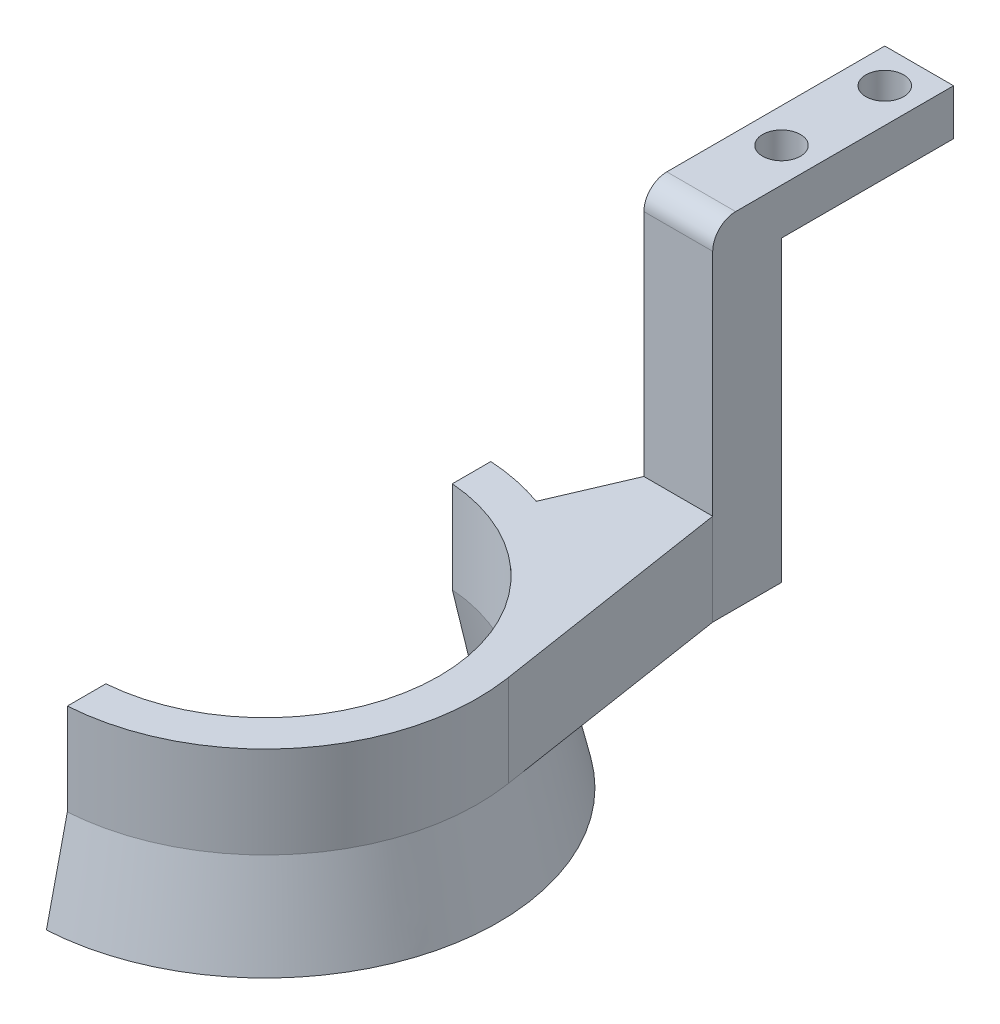
ISO-10303-21;
HEADER;
FILE_DESCRIPTION(('STEP AP214'),'2;1');
FILE_NAME('part.step','',(''),(''),'','','');
FILE_SCHEMA(('AUTOMOTIVE_DESIGN { 1 0 10303 214 1 1 1 1 }'));
ENDSEC;
DATA;
#1=APPLICATION_CONTEXT('core data for automotive mechanical design processes');
#2=APPLICATION_PROTOCOL_DEFINITION('international standard','automotive_design',2000,#1);
#3=PRODUCT_CONTEXT('',#1,'mechanical');
#4=PRODUCT('Part','Part','',(#3));
#5=PRODUCT_RELATED_PRODUCT_CATEGORY('part','',(#4));
#6=PRODUCT_DEFINITION_FORMATION('','',#4);
#7=PRODUCT_DEFINITION_CONTEXT('part definition',#1,'design');
#8=PRODUCT_DEFINITION('design','',#6,#7);
#9=PRODUCT_DEFINITION_SHAPE('','',#8);
#10=(LENGTH_UNIT() NAMED_UNIT(*) SI_UNIT(.MILLI.,.METRE.));
#11=(NAMED_UNIT(*) PLANE_ANGLE_UNIT() SI_UNIT($,.RADIAN.));
#12=(NAMED_UNIT(*) SI_UNIT($,.STERADIAN.) SOLID_ANGLE_UNIT());
#13=UNCERTAINTY_MEASURE_WITH_UNIT(LENGTH_MEASURE(1.E-05),#10,'distance_accuracy_value','');
#14=(GEOMETRIC_REPRESENTATION_CONTEXT(3) GLOBAL_UNCERTAINTY_ASSIGNED_CONTEXT((#13)) GLOBAL_UNIT_ASSIGNED_CONTEXT((#10,
#11,#12)) REPRESENTATION_CONTEXT('',''));
#15=CARTESIAN_POINT('',(0.,0.,0.));
#16=DIRECTION('',(0.,0.,1.));
#17=DIRECTION('',(1.,0.,0.));
#18=AXIS2_PLACEMENT_3D('',#15,#16,#17);
#19=CARTESIAN_POINT('',(56.,-20.,0.));
#20=DIRECTION('',(0.,1.,0.));
#21=DIRECTION('',(0.,0.,1.));
#22=AXIS2_PLACEMENT_3D('',#19,#20,#21);
#23=PLANE('',#22);
#24=DIRECTION('',(-1.,0.,0.));
#25=VECTOR('',#24,1.);
#26=CARTESIAN_POINT('',(56.,-20.,21.));
#27=LINE('',#26,#25);
#28=CARTESIAN_POINT('',(56.,-20.,21.));
#29=VERTEX_POINT('',#28);
#30=CARTESIAN_POINT('',(50.,-20.,21.));
#31=VERTEX_POINT('',#30);
#32=EDGE_CURVE('E356',#29,#31,#27,.T.);
#33=ORIENTED_EDGE('',*,*,#32,.T.);
#34=DIRECTION('',(-0.394272189935279,0.,0.918993710665987));
#35=VECTOR('',#34,1.);
#36=CARTESIAN_POINT('',(58.5417102781997,-20.,1.09045977783739));
#37=LINE('',#36,#35);
#38=CARTESIAN_POINT('',(47.1838265434992,-20.,27.5641091629961));
#39=VERTEX_POINT('',#38);
#40=EDGE_CURVE('E234',#31,#39,#37,.T.);
#41=ORIENTED_EDGE('',*,*,#40,.T.);
#42=CARTESIAN_POINT('',(41.,-20.,45.));
#43=DIRECTION('',(0.,-1.,0.));
#44=DIRECTION('',(0.,0.,1.));
#45=AXIS2_PLACEMENT_3D('',#42,#43,#44);
#46=CIRCLE('',#45,18.5);
#47=CARTESIAN_POINT('',(42.2,-20.,26.5389599426251));
#48=VERTEX_POINT('',#47);
#49=EDGE_CURVE('E230',#48,#39,#46,.T.);
#50=ORIENTED_EDGE('',*,*,#49,.F.);
#51=DIRECTION('',(0.,0.,1.));
#52=VECTOR('',#51,1.);
#53=CARTESIAN_POINT('',(42.2,-20.,0.));
#54=LINE('',#53,#52);
#55=CARTESIAN_POINT('',(42.2,-20.,29.8975995285518));
#56=VERTEX_POINT('',#55);
#57=EDGE_CURVE('E235',#48,#56,#54,.T.);
#58=ORIENTED_EDGE('',*,*,#57,.T.);
#59=CARTESIAN_POINT('',(41.,-20.,45.));
#60=DIRECTION('',(0.,-1.,0.));
#61=DIRECTION('',(0.,0.,1.));
#62=AXIS2_PLACEMENT_3D('',#59,#60,#61);
#63=CIRCLE('',#62,15.15);
#64=CARTESIAN_POINT('',(42.2,-20.0000000000001,60.1024004714482));
#65=VERTEX_POINT('',#64);
#66=EDGE_CURVE('E226',#56,#65,#63,.T.);
#67=ORIENTED_EDGE('',*,*,#66,.T.);
#68=CARTESIAN_POINT('',(42.2,-20.0000000000001,63.4610400573749));
#69=VERTEX_POINT('',#68);
#70=EDGE_CURVE('E240',#65,#69,#54,.T.);
#71=ORIENTED_EDGE('',*,*,#70,.T.);
#72=CARTESIAN_POINT('',(59.2956971835305,-20.,42.2582004871701));
#73=VERTEX_POINT('',#72);
#74=EDGE_CURVE('E238',#73,#69,#46,.T.);
#75=ORIENTED_EDGE('',*,*,#74,.F.);
#76=CARTESIAN_POINT('',(41.,-20.,45.));
#77=DIRECTION('',(0.,-1.,0.));
#78=DIRECTION('',(0.987408050601735,0.,-0.158193999907965));
#79=AXIS2_PLACEMENT_3D('',#76,#77,#78);
#80=CIRCLE('',#79,18.5);
#81=CARTESIAN_POINT('',(59.2670489361321,-20.,42.0734110017026));
#82=VERTEX_POINT('',#81);
#83=EDGE_CURVE('E55',#82,#73,#80,.T.);
#84=ORIENTED_EDGE('',*,*,#83,.F.);
#85=DIRECTION('',(0.153201646089768,0.,0.988194948193617));
#86=VECTOR('',#85,1.);
#87=CARTESIAN_POINT('',(56.,-20.,21.));
#88=LINE('',#87,#86);
#89=EDGE_CURVE('E218',#29,#82,#88,.T.);
#90=ORIENTED_EDGE('',*,*,#89,.F.);
#91=EDGE_LOOP('',(#33,#41,#50,#58,#67,#71,#75,#84,#90));
#92=FACE_BOUND('',#91,.T.);
#93=ADVANCED_FACE('F45',(#92),#23,.T.);
#94=CARTESIAN_POINT('',(56.,-28.,0.));
#95=DIRECTION('',(0.,1.,0.));
#96=DIRECTION('',(0.,0.,1.));
#97=AXIS2_PLACEMENT_3D('',#94,#95,#96);
#98=PLANE('',#97);
#99=DIRECTION('',(-0.394272189935279,0.,0.918993710665987));
#100=VECTOR('',#99,1.);
#101=CARTESIAN_POINT('',(58.5417102781997,-28.,1.09045977783738));
#102=LINE('',#101,#100);
#103=CARTESIAN_POINT('',(50.,-28.,21.));
#104=VERTEX_POINT('',#103);
#105=CARTESIAN_POINT('',(47.1838587987285,-28.,27.5640274167845));
#106=VERTEX_POINT('',#105);
#107=EDGE_CURVE('E251',#104,#106,#102,.T.);
#108=ORIENTED_EDGE('',*,*,#107,.F.);
#109=DIRECTION('',(0.,0.,1.));
#110=VECTOR('',#109,1.);
#111=CARTESIAN_POINT('',(50.,-28.,15.));
#112=LINE('',#111,#110);
#113=CARTESIAN_POINT('',(50.,-28.,15.));
#114=VERTEX_POINT('',#113);
#115=EDGE_CURVE('E338',#114,#104,#112,.T.);
#116=ORIENTED_EDGE('',*,*,#115,.F.);
#117=DIRECTION('',(-1.,0.,0.));
#118=VECTOR('',#117,1.);
#119=CARTESIAN_POINT('',(56.,-28.,15.));
#120=LINE('',#119,#118);
#121=CARTESIAN_POINT('',(56.,-28.,15.));
#122=VERTEX_POINT('',#121);
#123=EDGE_CURVE('E335',#122,#114,#120,.T.);
#124=ORIENTED_EDGE('',*,*,#123,.F.);
#125=DIRECTION('',(0.,0.,-1.));
#126=VECTOR('',#125,1.);
#127=CARTESIAN_POINT('',(56.,-28.,15.));
#128=LINE('',#127,#126);
#129=CARTESIAN_POINT('',(56.,-28.,21.));
#130=VERTEX_POINT('',#129);
#131=EDGE_CURVE('E333',#130,#122,#128,.T.);
#132=ORIENTED_EDGE('',*,*,#131,.F.);
#133=DIRECTION('',(0.153201646089768,0.,0.988194948193617));
#134=VECTOR('',#133,1.);
#135=CARTESIAN_POINT('',(56.,-28.,21.));
#136=LINE('',#135,#134);
#137=CARTESIAN_POINT('',(59.2670484929375,-28.,42.0734110604464));
#138=VERTEX_POINT('',#137);
#139=EDGE_CURVE('E215',#130,#138,#136,.T.);
#140=ORIENTED_EDGE('',*,*,#139,.T.);
#141=CARTESIAN_POINT('',(42.2,-28.,26.5389599426251));
#142=CARTESIAN_POINT('',(74.8133971291866,-28.,28.6588879874911));
#143=CARTESIAN_POINT('',(74.8133971291866,-28.0000000000001,61.3411120125089));
#144=CARTESIAN_POINT('',(42.2,-28.0000000000001,63.4610400573749));
#145=(BOUNDED_CURVE() B_SPLINE_CURVE(3,(#141,#142,#143,#144),.UNSPECIFIED.,.F.,
.F.) B_SPLINE_CURVE_WITH_KNOTS((4,4),(0.,1.),
.UNSPECIFIED.) CURVE() GEOMETRIC_REPRESENTATION_ITEM() RATIONAL_B_SPLINE_CURVE((1.,
0.376576576576576,0.376576576576576,1.)) REPRESENTATION_ITEM(''));
#146=EDGE_CURVE('E11',#106,#138,#145,.T.);
#147=ORIENTED_EDGE('',*,*,#146,.F.);
#148=EDGE_LOOP('',(#108,#116,#124,#132,#140,#147));
#149=FACE_BOUND('',#148,.T.);
#150=ADVANCED_FACE('F482',(#149),#98,.F.);
#151=CARTESIAN_POINT('',(42.2,-28.,0.));
#152=DIRECTION('',(1.,0.,0.));
#153=DIRECTION('',(0.,0.,1.));
#154=AXIS2_PLACEMENT_3D('',#151,#152,#153);
#155=PLANE('',#154);
#156=DIRECTION('',(0.,1.,0.));
#157=VECTOR('',#156,1.);
#158=CARTESIAN_POINT('',(42.2,-28.0000000000001,63.4610400573749));
#159=LINE('',#158,#157);
#160=CARTESIAN_POINT('',(42.2,-28.0000000000001,63.4610400573749));
#161=VERTEX_POINT('',#160);
#162=EDGE_CURVE('E288',#161,#69,#159,.T.);
#163=ORIENTED_EDGE('',*,*,#162,.T.);
#164=ORIENTED_EDGE('',*,*,#70,.F.);
#165=DIRECTION('',(0.,1.,0.));
#166=VECTOR('',#165,1.);
#167=CARTESIAN_POINT('',(42.2,-28.0010000000001,60.1024004714482));
#168=LINE('',#167,#166);
#169=CARTESIAN_POINT('',(42.2,-28.,60.1024004714482));
#170=VERTEX_POINT('',#169);
#171=EDGE_CURVE('E229',#170,#65,#168,.T.);
#172=ORIENTED_EDGE('',*,*,#171,.F.);
#173=DIRECTION('',(0.,-0.970838274147742,0.239735365454984));
#174=VECTOR('',#173,1.);
#175=CARTESIAN_POINT('',(42.2,-28.0000000000001,60.1024004714482));
#176=LINE('',#175,#174);
#177=CARTESIAN_POINT('',(42.2,-36.0000000000001,62.0778921415964));
#178=VERTEX_POINT('',#177);
#179=EDGE_CURVE('E388',#170,#178,#176,.T.);
#180=ORIENTED_EDGE('',*,*,#179,.T.);
#181=CARTESIAN_POINT('',(42.2,-36.0000000000001,62.0778921415964));
#182=DIRECTION('',(0.,0.,1.));
#183=VECTOR('',#182,1.);
#184=LINE('',#181,#183);
#185=CARTESIAN_POINT('',(42.2,-36.0000000000001,65.2845359818754));
#186=VERTEX_POINT('',#185);
#187=EDGE_CURVE('E296',#178,#186,#184,.T.);
#188=ORIENTED_EDGE('',*,*,#187,.T.);
#189=DIRECTION('',(0.,-0.97499269726956,0.222236901236109));
#190=VECTOR('',#189,1.);
#191=CARTESIAN_POINT('',(42.2,-28.0000000000001,63.4610400573749));
#192=LINE('',#191,#190);
#193=EDGE_CURVE('E387',#161,#186,#192,.T.);
#194=ORIENTED_EDGE('',*,*,#193,.F.);
#195=EDGE_LOOP('',(#163,#164,#172,#180,#188,#194));
#196=FACE_BOUND('',#195,.T.);
#197=ADVANCED_FACE('F503',(#196),#155,.F.);
#198=CARTESIAN_POINT('',(50.,2.,0.));
#199=DIRECTION('',(1.,0.,0.));
#200=DIRECTION('',(0.,0.,1.));
#201=AXIS2_PLACEMENT_3D('',#198,#199,#200);
#202=PLANE('',#201);
#203=DIRECTION('',(0.,0.,1.));
#204=VECTOR('',#203,1.);
#205=CARTESIAN_POINT('',(50.,-2.,15.));
#206=LINE('',#205,#204);
#207=CARTESIAN_POINT('',(50.,-2.,0.));
#208=VERTEX_POINT('',#207);
#209=CARTESIAN_POINT('',(50.,-2.,15.));
#210=VERTEX_POINT('',#209);
#211=EDGE_CURVE('E381',#208,#210,#206,.T.);
#212=ORIENTED_EDGE('',*,*,#211,.T.);
#213=DIRECTION('',(0.,1.,0.));
#214=VECTOR('',#213,1.);
#215=CARTESIAN_POINT('',(50.,2.,15.));
#216=LINE('',#215,#214);
#217=EDGE_CURVE('E341',#114,#210,#216,.T.);
#218=ORIENTED_EDGE('',*,*,#217,.F.);
#219=ORIENTED_EDGE('',*,*,#115,.T.);
#220=DIRECTION('',(0.,1.,0.));
#221=VECTOR('',#220,1.);
#222=CARTESIAN_POINT('',(50.,-28.,21.));
#223=LINE('',#222,#221);
#224=EDGE_CURVE('E330',#104,#31,#223,.T.);
#225=ORIENTED_EDGE('',*,*,#224,.T.);
#226=DIRECTION('',(0.,-1.,0.));
#227=VECTOR('',#226,1.);
#228=CARTESIAN_POINT('',(50.,0.,21.));
#229=LINE('',#228,#227);
#230=CARTESIAN_POINT('',(50.,0.,21.));
#231=VERTEX_POINT('',#230);
#232=EDGE_CURVE('E345',#231,#31,#229,.T.);
#233=ORIENTED_EDGE('',*,*,#232,.F.);
#234=CARTESIAN_POINT('',(50.,0.,19.));
#235=DIRECTION('',(1.,0.,0.));
#236=DIRECTION('',(0.,0.,-1.));
#237=AXIS2_PLACEMENT_3D('',#234,#235,#236);
#238=CIRCLE('',#237,2.);
#239=CARTESIAN_POINT('',(50.,2.,19.));
#240=VERTEX_POINT('',#239);
#241=EDGE_CURVE('E352',#240,#231,#238,.T.);
#242=ORIENTED_EDGE('',*,*,#241,.F.);
#243=DIRECTION('',(0.,0.,-1.));
#244=VECTOR('',#243,1.);
#245=CARTESIAN_POINT('',(50.,2.,0.));
#246=LINE('',#245,#244);
#247=CARTESIAN_POINT('',(50.,2.,0.));
#248=VERTEX_POINT('',#247);
#249=EDGE_CURVE('E189',#240,#248,#246,.T.);
#250=ORIENTED_EDGE('',*,*,#249,.T.);
#251=DIRECTION('',(0.,-1.,0.));
#252=VECTOR('',#251,1.);
#253=CARTESIAN_POINT('',(50.,2.,0.));
#254=LINE('',#253,#252);
#255=EDGE_CURVE('E180',#248,#208,#254,.T.);
#256=ORIENTED_EDGE('',*,*,#255,.T.);
#257=EDGE_LOOP('',(#212,#218,#219,#225,#233,#242,#250,#256));
#258=FACE_BOUND('',#257,.T.);
#259=ADVANCED_FACE('F523',(#258),#202,.F.);
#260=CARTESIAN_POINT('',(56.,2.,0.));
#261=DIRECTION('',(0.,1.,0.));
#262=DIRECTION('',(0.,0.,1.));
#263=AXIS2_PLACEMENT_3D('',#260,#261,#262);
#264=PLANE('',#263);
#265=CARTESIAN_POINT('',(53.,2.,3.));
#266=DIRECTION('',(0.,-1.,0.));
#267=DIRECTION('',(0.,0.,1.));
#268=AXIS2_PLACEMENT_3D('',#265,#266,#267);
#269=CIRCLE('',#268,1.65);
#270=CARTESIAN_POINT('',(53.,2.,4.65));
#271=VERTEX_POINT('',#270);
#272=EDGE_CURVE('E195',#271,#271,#269,.T.);
#273=ORIENTED_EDGE('',*,*,#272,.T.);
#274=EDGE_LOOP('',(#273));
#275=FACE_BOUND('',#274,.T.);
#276=DIRECTION('',(0.,0.,1.));
#277=VECTOR('',#276,1.);
#278=CARTESIAN_POINT('',(56.,2.,0.));
#279=LINE('',#278,#277);
#280=CARTESIAN_POINT('',(56.,2.,0.));
#281=VERTEX_POINT('',#280);
#282=CARTESIAN_POINT('',(56.,2.,19.));
#283=VERTEX_POINT('',#282);
#284=EDGE_CURVE('E173',#281,#283,#279,.T.);
#285=ORIENTED_EDGE('',*,*,#284,.F.);
#286=DIRECTION('',(1.,0.,0.));
#287=VECTOR('',#286,1.);
#288=CARTESIAN_POINT('',(56.,2.,0.));
#289=LINE('',#288,#287);
#290=EDGE_CURVE('E181',#248,#281,#289,.T.);
#291=ORIENTED_EDGE('',*,*,#290,.F.);
#292=ORIENTED_EDGE('',*,*,#249,.F.);
#293=DIRECTION('',(-1.,0.,0.));
#294=VECTOR('',#293,1.);
#295=CARTESIAN_POINT('',(56.,2.,19.));
#296=LINE('',#295,#294);
#297=EDGE_CURVE('E194',#283,#240,#296,.T.);
#298=ORIENTED_EDGE('',*,*,#297,.F.);
#299=EDGE_LOOP('',(#285,#291,#292,#298));
#300=FACE_BOUND('',#299,.T.);
#301=CARTESIAN_POINT('',(53.,2.,12.));
#302=DIRECTION('',(0.,-1.,0.));
#303=DIRECTION('',(0.,0.,1.));
#304=AXIS2_PLACEMENT_3D('',#301,#302,#303);
#305=CIRCLE('',#304,1.65);
#306=CARTESIAN_POINT('',(53.,2.,13.65));
#307=VERTEX_POINT('',#306);
#308=EDGE_CURVE('E199',#307,#307,#305,.T.);
#309=ORIENTED_EDGE('',*,*,#308,.T.);
#310=EDGE_LOOP('',(#309));
#311=FACE_BOUND('',#310,.T.);
#312=ADVANCED_FACE('F192',(#275,#300,#311),#264,.T.);
#313=CARTESIAN_POINT('',(56.,2.,0.));
#314=DIRECTION('',(-1.,0.,0.));
#315=DIRECTION('',(0.,0.,-1.));
#316=AXIS2_PLACEMENT_3D('',#313,#314,#315);
#317=PLANE('',#316);
#318=ORIENTED_EDGE('',*,*,#131,.T.);
#319=DIRECTION('',(0.,1.,0.));
#320=VECTOR('',#319,1.);
#321=CARTESIAN_POINT('',(56.,2.,15.));
#322=LINE('',#321,#320);
#323=CARTESIAN_POINT('',(56.,-2.,15.));
#324=VERTEX_POINT('',#323);
#325=EDGE_CURVE('E342',#122,#324,#322,.T.);
#326=ORIENTED_EDGE('',*,*,#325,.T.);
#327=DIRECTION('',(0.,0.,-1.));
#328=VECTOR('',#327,1.);
#329=CARTESIAN_POINT('',(56.,-2.,15.));
#330=LINE('',#329,#328);
#331=CARTESIAN_POINT('',(56.,-2.,0.));
#332=VERTEX_POINT('',#331);
#333=EDGE_CURVE('E177',#324,#332,#330,.T.);
#334=ORIENTED_EDGE('',*,*,#333,.T.);
#335=DIRECTION('',(0.,-1.,0.));
#336=VECTOR('',#335,1.);
#337=CARTESIAN_POINT('',(56.,2.,0.));
#338=LINE('',#337,#336);
#339=EDGE_CURVE('E168',#281,#332,#338,.T.);
#340=ORIENTED_EDGE('',*,*,#339,.F.);
#341=ORIENTED_EDGE('',*,*,#284,.T.);
#342=CARTESIAN_POINT('',(56.,0.,19.));
#343=DIRECTION('',(1.,0.,0.));
#344=DIRECTION('',(0.,0.,-1.));
#345=AXIS2_PLACEMENT_3D('',#342,#343,#344);
#346=CIRCLE('',#345,2.);
#347=CARTESIAN_POINT('',(56.,0.,21.));
#348=VERTEX_POINT('',#347);
#349=EDGE_CURVE('E344',#283,#348,#346,.T.);
#350=ORIENTED_EDGE('',*,*,#349,.T.);
#351=DIRECTION('',(0.,-1.,0.));
#352=VECTOR('',#351,1.);
#353=CARTESIAN_POINT('',(56.,0.,21.));
#354=LINE('',#353,#352);
#355=EDGE_CURVE('E347',#348,#29,#354,.T.);
#356=ORIENTED_EDGE('',*,*,#355,.T.);
#357=DIRECTION('',(0.,1.,0.));
#358=VECTOR('',#357,1.);
#359=CARTESIAN_POINT('',(56.,-28.,21.));
#360=LINE('',#359,#358);
#361=EDGE_CURVE('E213',#130,#29,#360,.T.);
#362=ORIENTED_EDGE('',*,*,#361,.F.);
#363=EDGE_LOOP('',(#318,#326,#334,#340,#341,#350,#356,#362));
#364=FACE_BOUND('',#363,.T.);
#365=ADVANCED_FACE('F47',(#364),#317,.F.);
#366=CARTESIAN_POINT('',(56.,2.,0.));
#367=DIRECTION('',(0.,0.,1.));
#368=DIRECTION('',(-1.,0.,0.));
#369=AXIS2_PLACEMENT_3D('',#366,#367,#368);
#370=PLANE('',#369);
#371=ORIENTED_EDGE('',*,*,#255,.F.);
#372=ORIENTED_EDGE('',*,*,#290,.T.);
#373=ORIENTED_EDGE('',*,*,#339,.T.);
#374=DIRECTION('',(-1.,0.,0.));
#375=VECTOR('',#374,1.);
#376=CARTESIAN_POINT('',(56.,-2.,0.));
#377=LINE('',#376,#375);
#378=EDGE_CURVE('E375',#332,#208,#377,.T.);
#379=ORIENTED_EDGE('',*,*,#378,.T.);
#380=EDGE_LOOP('',(#371,#372,#373,#379));
#381=FACE_BOUND('',#380,.T.);
#382=ADVANCED_FACE('F184',(#381),#370,.F.);
#383=CARTESIAN_POINT('',(53.,2.,3.));
#384=DIRECTION('',(0.,-1.,0.));
#385=DIRECTION('',(0.,0.,-1.));
#386=AXIS2_PLACEMENT_3D('',#383,#384,#385);
#387=CYLINDRICAL_SURFACE('',#386,1.65);
#388=ORIENTED_EDGE('',*,*,#272,.F.);
#389=EDGE_LOOP('',(#388));
#390=FACE_BOUND('',#389,.T.);
#391=CARTESIAN_POINT('',(53.,-2.,3.));
#392=DIRECTION('',(0.,1.,0.));
#393=DIRECTION('',(0.,0.,-1.));
#394=AXIS2_PLACEMENT_3D('',#391,#392,#393);
#395=CIRCLE('',#394,1.65);
#396=CARTESIAN_POINT('',(53.,-2.,1.35));
#397=VERTEX_POINT('',#396);
#398=EDGE_CURVE('E373',#397,#397,#395,.T.);
#399=ORIENTED_EDGE('',*,*,#398,.F.);
#400=EDGE_LOOP('',(#399));
#401=FACE_BOUND('',#400,.T.);
#402=ADVANCED_FACE('F367',(#390,#401),#387,.F.);
#403=CARTESIAN_POINT('',(53.,2.,12.));
#404=DIRECTION('',(0.,-1.,0.));
#405=DIRECTION('',(0.,0.,-1.));
#406=AXIS2_PLACEMENT_3D('',#403,#404,#405);
#407=CYLINDRICAL_SURFACE('',#406,1.65);
#408=ORIENTED_EDGE('',*,*,#308,.F.);
#409=EDGE_LOOP('',(#408));
#410=FACE_BOUND('',#409,.T.);
#411=CARTESIAN_POINT('',(53.,-2.,12.));
#412=DIRECTION('',(0.,1.,0.));
#413=DIRECTION('',(0.,0.,-1.));
#414=AXIS2_PLACEMENT_3D('',#411,#412,#413);
#415=CIRCLE('',#414,1.65);
#416=CARTESIAN_POINT('',(53.,-2.,10.35));
#417=VERTEX_POINT('',#416);
#418=EDGE_CURVE('E371',#417,#417,#415,.T.);
#419=ORIENTED_EDGE('',*,*,#418,.F.);
#420=EDGE_LOOP('',(#419));
#421=FACE_BOUND('',#420,.T.);
#422=ADVANCED_FACE('F363',(#410,#421),#407,.F.);
#423=CARTESIAN_POINT('',(56.,2.,15.));
#424=DIRECTION('',(0.,0.,-1.));
#425=DIRECTION('',(1.,0.,0.));
#426=AXIS2_PLACEMENT_3D('',#423,#424,#425);
#427=PLANE('',#426);
#428=DIRECTION('',(1.,0.,0.));
#429=VECTOR('',#428,1.);
#430=CARTESIAN_POINT('',(56.,-2.,15.));
#431=LINE('',#430,#429);
#432=EDGE_CURVE('E384',#210,#324,#431,.T.);
#433=ORIENTED_EDGE('',*,*,#432,.T.);
#434=ORIENTED_EDGE('',*,*,#325,.F.);
#435=ORIENTED_EDGE('',*,*,#123,.T.);
#436=ORIENTED_EDGE('',*,*,#217,.T.);
#437=EDGE_LOOP('',(#433,#434,#435,#436));
#438=FACE_BOUND('',#437,.T.);
#439=ADVANCED_FACE('F366',(#438),#427,.T.);
#440=CARTESIAN_POINT('',(56.,0.,21.));
#441=DIRECTION('',(0.,0.,1.));
#442=DIRECTION('',(-1.,0.,0.));
#443=AXIS2_PLACEMENT_3D('',#440,#441,#442);
#444=PLANE('',#443);
#445=ORIENTED_EDGE('',*,*,#232,.T.);
#446=ORIENTED_EDGE('',*,*,#32,.F.);
#447=ORIENTED_EDGE('',*,*,#355,.F.);
#448=DIRECTION('',(-1.,0.,0.));
#449=VECTOR('',#448,1.);
#450=CARTESIAN_POINT('',(56.,0.,21.));
#451=LINE('',#450,#449);
#452=EDGE_CURVE('E358',#348,#231,#451,.T.);
#453=ORIENTED_EDGE('',*,*,#452,.T.);
#454=EDGE_LOOP('',(#445,#446,#447,#453));
#455=FACE_BOUND('',#454,.T.);
#456=ADVANCED_FACE('F507',(#455),#444,.T.);
#457=CARTESIAN_POINT('',(56.,0.,19.));
#458=DIRECTION('',(-1.,0.,0.));
#459=DIRECTION('',(0.,0.,-1.));
#460=AXIS2_PLACEMENT_3D('',#457,#458,#459);
#461=CYLINDRICAL_SURFACE('',#460,2.);
#462=ORIENTED_EDGE('',*,*,#241,.T.);
#463=ORIENTED_EDGE('',*,*,#452,.F.);
#464=ORIENTED_EDGE('',*,*,#349,.F.);
#465=ORIENTED_EDGE('',*,*,#297,.T.);
#466=EDGE_LOOP('',(#462,#463,#464,#465));
#467=FACE_BOUND('',#466,.T.);
#468=ADVANCED_FACE('F510',(#467),#461,.T.);
#469=CARTESIAN_POINT('',(58.5417102781997,-28.,1.09045977783738));
#470=DIRECTION('',(0.918993710665987,0.,0.394272189935279));
#471=DIRECTION('',(-0.394272189935279,0.,0.918993710665987));
#472=AXIS2_PLACEMENT_3D('',#469,#470,#471);
#473=PLANE('',#472);
#474=ORIENTED_EDGE('',*,*,#40,.F.);
#475=ORIENTED_EDGE('',*,*,#224,.F.);
#476=ORIENTED_EDGE('',*,*,#107,.T.);
#477=DIRECTION('',(0.,1.,0.));
#478=VECTOR('',#477,1.);
#479=CARTESIAN_POINT('',(47.1838265434992,-28.,27.5641091629961));
#480=LINE('',#479,#478);
#481=EDGE_CURVE('E287',#106,#39,#480,.T.);
#482=ORIENTED_EDGE('',*,*,#481,.T.);
#483=EDGE_LOOP('',(#474,#475,#476,#482));
#484=FACE_BOUND('',#483,.T.);
#485=ADVANCED_FACE('F264',(#484),#473,.F.);
#486=CARTESIAN_POINT('',(41.,-28.,45.));
#487=DIRECTION('',(0.,1.,0.));
#488=DIRECTION('',(0.,0.,1.));
#489=AXIS2_PLACEMENT_3D('',#486,#487,#488);
#490=CYLINDRICAL_SURFACE('',#489,18.5);
#491=ORIENTED_EDGE('',*,*,#49,.T.);
#492=ORIENTED_EDGE('',*,*,#481,.F.);
#493=CARTESIAN_POINT('',(41.,-28.,45.));
#494=DIRECTION('',(0.,-1.,0.));
#495=DIRECTION('',(0.,0.,1.));
#496=AXIS2_PLACEMENT_3D('',#493,#494,#495);
#497=CIRCLE('',#496,18.5);
#498=CARTESIAN_POINT('',(42.2,-28.0000000000001,26.5389599426251));
#499=VERTEX_POINT('',#498);
#500=EDGE_CURVE('E317',#499,#106,#497,.T.);
#501=ORIENTED_EDGE('',*,*,#500,.F.);
#502=DIRECTION('',(0.,1.,0.));
#503=VECTOR('',#502,1.);
#504=CARTESIAN_POINT('',(42.2,-28.,26.5389599426251));
#505=LINE('',#504,#503);
#506=EDGE_CURVE('E280',#499,#48,#505,.T.);
#507=ORIENTED_EDGE('',*,*,#506,.T.);
#508=EDGE_LOOP('',(#491,#492,#501,#507));
#509=FACE_BOUND('',#508,.T.);
#510=ADVANCED_FACE('F253',(#509),#490,.T.);
#511=ORIENTED_EDGE('',*,*,#57,.F.);
#512=ORIENTED_EDGE('',*,*,#506,.F.);
#513=DIRECTION('',(0.,-0.974992697269559,-0.222236901236111));
#514=VECTOR('',#513,1.);
#515=CARTESIAN_POINT('',(42.2,-32.,25.6272119803748));
#516=LINE('',#515,#514);
#517=CARTESIAN_POINT('',(42.2,-36.,24.7154640181245));
#518=VERTEX_POINT('',#517);
#519=EDGE_CURVE('E89',#499,#518,#516,.T.);
#520=ORIENTED_EDGE('',*,*,#519,.T.);
#521=CARTESIAN_POINT('',(42.2,-36.,24.7154640181245));
#522=DIRECTION('',(0.,0.,1.));
#523=VECTOR('',#522,1.);
#524=LINE('',#521,#523);
#525=CARTESIAN_POINT('',(42.2,-36.,27.9221078584036));
#526=VERTEX_POINT('',#525);
#527=EDGE_CURVE('E223',#518,#526,#524,.T.);
#528=ORIENTED_EDGE('',*,*,#527,.T.);
#529=DIRECTION('',(0.,-0.970838274147741,-0.239735365454985));
#530=VECTOR('',#529,1.);
#531=CARTESIAN_POINT('',(42.2,-28.,29.8975995285517));
#532=LINE('',#531,#530);
#533=CARTESIAN_POINT('',(42.2,-28.,29.8975995285517));
#534=VERTEX_POINT('',#533);
#535=EDGE_CURVE('E551',#534,#526,#532,.T.);
#536=ORIENTED_EDGE('',*,*,#535,.F.);
#537=DIRECTION('',(0.,1.,0.));
#538=VECTOR('',#537,1.);
#539=CARTESIAN_POINT('',(42.2,-28.0010000000001,29.8975995285517));
#540=LINE('',#539,#538);
#541=EDGE_CURVE('E241',#534,#56,#540,.T.);
#542=ORIENTED_EDGE('',*,*,#541,.T.);
#543=EDGE_LOOP('',(#511,#512,#520,#528,#536,#542));
#544=FACE_BOUND('',#543,.T.);
#545=ADVANCED_FACE('F263',(#544),#155,.F.);
#546=CARTESIAN_POINT('',(42.2,-28.,26.5389599426251));
#547=CARTESIAN_POINT('',(74.8133971291866,-28.,28.6588879874911));
#548=CARTESIAN_POINT('',(74.8133971291866,-28.0000000000001,61.3411120125089));
#549=CARTESIAN_POINT('',(42.2,-28.0000000000001,63.4610400573749));
#550=(BOUNDED_CURVE() B_SPLINE_CURVE(3,(#546,#547,#548,#549),.UNSPECIFIED.,.F.,
.F.) B_SPLINE_CURVE_WITH_KNOTS((4,4),(0.,1.),
.UNSPECIFIED.) CURVE() GEOMETRIC_REPRESENTATION_ITEM() RATIONAL_B_SPLINE_CURVE((1.,
0.376576576576576,0.376576576576576,1.)) REPRESENTATION_ITEM(''));
#551=CARTESIAN_POINT('',(59.2956961096005,-28.,42.2582006323139));
#552=VERTEX_POINT('',#551);
#553=EDGE_CURVE('E207',#138,#552,#550,.T.);
#554=ORIENTED_EDGE('',*,*,#553,.F.);
#555=DIRECTION('',(0.,1.,0.));
#556=VECTOR('',#555,1.);
#557=CARTESIAN_POINT('',(59.2670489361322,-28.,42.0734110017035));
#558=LINE('',#557,#556);
#559=EDGE_CURVE('E204',#138,#82,#558,.T.);
#560=ORIENTED_EDGE('',*,*,#559,.T.);
#561=ORIENTED_EDGE('',*,*,#83,.T.);
#562=ORIENTED_EDGE('',*,*,#74,.T.);
#563=ORIENTED_EDGE('',*,*,#162,.F.);
#564=CARTESIAN_POINT('',(42.2,-28.,26.5389599426251));
#565=CARTESIAN_POINT('',(74.8133971291866,-28.,28.6588879874911));
#566=CARTESIAN_POINT('',(74.8133971291866,-28.0000000000001,61.3411120125089));
#567=CARTESIAN_POINT('',(42.2,-28.0000000000001,63.4610400573749));
#568=(BOUNDED_CURVE() B_SPLINE_CURVE(3,(#564,#565,#566,#567),.UNSPECIFIED.,.F.,
.F.) B_SPLINE_CURVE_WITH_KNOTS((4,4),(0.,1.),
.UNSPECIFIED.) CURVE() GEOMETRIC_REPRESENTATION_ITEM() RATIONAL_B_SPLINE_CURVE((1.,
0.376576576576576,0.376576576576576,1.)) REPRESENTATION_ITEM(''));
#569=EDGE_CURVE('E318',#552,#161,#568,.T.);
#570=ORIENTED_EDGE('',*,*,#569,.F.);
#571=EDGE_LOOP('',(#554,#560,#561,#562,#563,#570));
#572=FACE_BOUND('',#571,.T.);
#573=ADVANCED_FACE('F266',(#572),#490,.T.);
#574=CARTESIAN_POINT('',(41.,-28.0010000000001,45.));
#575=DIRECTION('',(0.,1.,0.));
#576=DIRECTION('',(0.,0.,1.));
#577=AXIS2_PLACEMENT_3D('',#574,#575,#576);
#578=CYLINDRICAL_SURFACE('',#577,15.15);
#579=CARTESIAN_POINT('',(41.,-28.,45.));
#580=DIRECTION('',(0.,-1.,0.));
#581=DIRECTION('',(0.,0.,1.));
#582=AXIS2_PLACEMENT_3D('',#579,#580,#581);
#583=CIRCLE('',#582,15.15);
#584=EDGE_CURVE('E79',#170,#534,#583,.F.);
#585=ORIENTED_EDGE('',*,*,#584,.F.);
#586=ORIENTED_EDGE('',*,*,#171,.T.);
#587=ORIENTED_EDGE('',*,*,#66,.F.);
#588=ORIENTED_EDGE('',*,*,#541,.F.);
#589=EDGE_LOOP('',(#585,#586,#587,#588));
#590=FACE_BOUND('',#589,.T.);
#591=ADVANCED_FACE('F553',(#590),#578,.F.);
#592=CARTESIAN_POINT('',(56.,-28.,21.));
#593=DIRECTION('',(0.988194948193617,0.,-0.153201646089768));
#594=DIRECTION('',(0.153201646089768,0.,0.988194948193617));
#595=AXIS2_PLACEMENT_3D('',#592,#593,#594);
#596=PLANE('',#595);
#597=ORIENTED_EDGE('',*,*,#139,.F.);
#598=ORIENTED_EDGE('',*,*,#361,.T.);
#599=ORIENTED_EDGE('',*,*,#89,.T.);
#600=ORIENTED_EDGE('',*,*,#559,.F.);
#601=EDGE_LOOP('',(#597,#598,#599,#600));
#602=FACE_BOUND('',#601,.T.);
#603=ADVANCED_FACE('F485',(#602),#596,.T.);
#604=CARTESIAN_POINT('',(41.,-36.,45.));
#605=DIRECTION('',(0.,1.,0.));
#606=DIRECTION('',(0.,0.,1.));
#607=AXIS2_PLACEMENT_3D('',#604,#605,#606);
#608=PLANE('',#607);
#609=CARTESIAN_POINT('',(42.2,-36.,27.9221078584036));
#610=CARTESIAN_POINT('',(72.0826229508197,-36.,30.0218486954851));
#611=CARTESIAN_POINT('',(72.0826229508197,-36.0000000000001,59.9781513045149));
#612=CARTESIAN_POINT('',(42.2,-36.0000000000001,62.0778921415964));
#613=(BOUNDED_CURVE() B_SPLINE_CURVE(3,(#609,#610,#611,#612),.UNSPECIFIED.,.F.,
.F.) B_SPLINE_CURVE_WITH_KNOTS((4,4),(0.,1.),
.UNSPECIFIED.) CURVE() GEOMETRIC_REPRESENTATION_ITEM() RATIONAL_B_SPLINE_CURVE((1.,
0.38006230529595,0.38006230529595,1.)) REPRESENTATION_ITEM(''));
#614=EDGE_CURVE('E467',#526,#178,#613,.T.);
#615=ORIENTED_EDGE('',*,*,#614,.F.);
#616=ORIENTED_EDGE('',*,*,#527,.F.);
#617=CARTESIAN_POINT('',(42.2,-36.0000000000001,65.2845359818754));
#618=CARTESIAN_POINT('',(78.4202816901408,-36.0000000000001,63.1418033077337));
#619=CARTESIAN_POINT('',(78.4202816901408,-36.,26.8581966922663));
#620=CARTESIAN_POINT('',(42.2,-36.,24.7154640181245));
#621=(BOUNDED_CURVE() B_SPLINE_CURVE(3,(#617,#618,#619,#620),.UNSPECIFIED.,.F.,
.F.) B_SPLINE_CURVE_WITH_KNOTS((4,4),(0.,1.),
.UNSPECIFIED.) CURVE() GEOMETRIC_REPRESENTATION_ITEM() RATIONAL_B_SPLINE_CURVE((1.,
0.372703412073491,0.372703412073491,1.)) REPRESENTATION_ITEM(''));
#622=EDGE_CURVE('E96',#186,#518,#621,.T.);
#623=ORIENTED_EDGE('',*,*,#622,.F.);
#624=ORIENTED_EDGE('',*,*,#187,.F.);
#625=EDGE_LOOP('',(#615,#616,#623,#624));
#626=FACE_BOUND('',#625,.T.);
#627=ADVANCED_FACE('F420',(#626),#608,.F.);
#628=CARTESIAN_POINT('',(42.2,-28.,29.8975995285517));
#629=CARTESIAN_POINT('',(42.2,-36.,27.9221078584036));
#630=CARTESIAN_POINT('',(68.1923076923077,-28.,31.9628850631088));
#631=CARTESIAN_POINT('',(72.0826229508197,-36.,30.0218486954851));
#632=CARTESIAN_POINT('',(68.1923076923077,-28.0000000000001,58.0371149368912));
#633=CARTESIAN_POINT('',(72.0826229508197,-36.0000000000001,59.9781513045149));
#634=CARTESIAN_POINT('',(42.2,-28.0000000000001,60.1024004714482));
#635=CARTESIAN_POINT('',(42.2,-36.0000000000001,62.0778921415964));
#636=(BOUNDED_SURFACE() B_SPLINE_SURFACE(3,1,((#628,#629),(#630,#631),(#632,#633),(#634,#635)),
.UNSPECIFIED.,.F.,.F.,.F.) B_SPLINE_SURFACE_WITH_KNOTS((4,4),(2,2),(0.,1.),(0.,1.),
.UNSPECIFIED.) GEOMETRIC_REPRESENTATION_ITEM() RATIONAL_B_SPLINE_SURFACE(((1.,1.),
(0.386138613861386,0.38006230529595),(0.386138613861386,0.38006230529595),(1.,1.))) REPRESENTATION_ITEM('') SURFACE());
#637=ORIENTED_EDGE('',*,*,#584,.T.);
#638=ORIENTED_EDGE('',*,*,#535,.T.);
#639=ORIENTED_EDGE('',*,*,#614,.T.);
#640=ORIENTED_EDGE('',*,*,#179,.F.);
#641=EDGE_LOOP('',(#637,#638,#639,#640));
#642=FACE_BOUND('',#641,.T.);
#643=ADVANCED_FACE('F415',(#642),#636,.F.);
#644=CARTESIAN_POINT('',(42.2,-28.0000000000001,63.4610400573749));
#645=CARTESIAN_POINT('',(42.2,-36.0000000000001,65.2845359818754));
#646=CARTESIAN_POINT('',(74.8133971291866,-28.0000000000001,61.3411120125089));
#647=CARTESIAN_POINT('',(78.4202816901408,-36.0000000000001,63.1418033077337));
#648=CARTESIAN_POINT('',(74.8133971291866,-28.,28.6588879874911));
#649=CARTESIAN_POINT('',(78.4202816901408,-36.,26.8581966922663));
#650=CARTESIAN_POINT('',(42.2,-28.,26.5389599426251));
#651=CARTESIAN_POINT('',(42.2,-36.,24.7154640181245));
#652=(BOUNDED_SURFACE() B_SPLINE_SURFACE(3,1,((#644,#645),(#646,#647),(#648,#649),(#650,#651)),
.UNSPECIFIED.,.F.,.F.,.F.) B_SPLINE_SURFACE_WITH_KNOTS((4,4),(2,2),(0.,1.),(0.,1.),
.UNSPECIFIED.) GEOMETRIC_REPRESENTATION_ITEM() RATIONAL_B_SPLINE_SURFACE(((1.,1.),
(0.376576576576576,0.372703412073491),(0.376576576576576,0.372703412073491),(1.,1.))) REPRESENTATION_ITEM('') SURFACE());
#653=ORIENTED_EDGE('',*,*,#569,.T.);
#654=ORIENTED_EDGE('',*,*,#193,.T.);
#655=ORIENTED_EDGE('',*,*,#622,.T.);
#656=ORIENTED_EDGE('',*,*,#519,.F.);
#657=ORIENTED_EDGE('',*,*,#500,.T.);
#658=ORIENTED_EDGE('',*,*,#146,.T.);
#659=ORIENTED_EDGE('',*,*,#553,.T.);
#660=EDGE_LOOP('',(#653,#654,#655,#656,#657,#658,#659));
#661=FACE_BOUND('',#660,.T.);
#662=ADVANCED_FACE('F402',(#661),#652,.F.);
#663=CARTESIAN_POINT('',(56.,-2.,0.));
#664=DIRECTION('',(0.,-1.,0.));
#665=DIRECTION('',(0.,0.,-1.));
#666=AXIS2_PLACEMENT_3D('',#663,#664,#665);
#667=PLANE('',#666);
#668=ORIENTED_EDGE('',*,*,#418,.T.);
#669=EDGE_LOOP('',(#668));
#670=FACE_BOUND('',#669,.T.);
#671=ORIENTED_EDGE('',*,*,#333,.F.);
#672=ORIENTED_EDGE('',*,*,#432,.F.);
#673=ORIENTED_EDGE('',*,*,#211,.F.);
#674=ORIENTED_EDGE('',*,*,#378,.F.);
#675=EDGE_LOOP('',(#671,#672,#673,#674));
#676=FACE_BOUND('',#675,.T.);
#677=ORIENTED_EDGE('',*,*,#398,.T.);
#678=EDGE_LOOP('',(#677));
#679=FACE_BOUND('',#678,.T.);
#680=ADVANCED_FACE('F414',(#670,#676,#679),#667,.T.);
#681=CLOSED_SHELL('',(#93,#150,#197,#259,#312,#365,#382,#402,#422,#439,#456,#468,#485,#510,#545,
#573,#591,#603,#627,#643,#662,#680));
#682=MANIFOLD_SOLID_BREP('B2',#681);
#683=ADVANCED_BREP_SHAPE_REPRESENTATION('',(#18,#682),#14);
#684=SHAPE_DEFINITION_REPRESENTATION(#9,#683);
ENDSEC;
END-ISO-10303-21;
